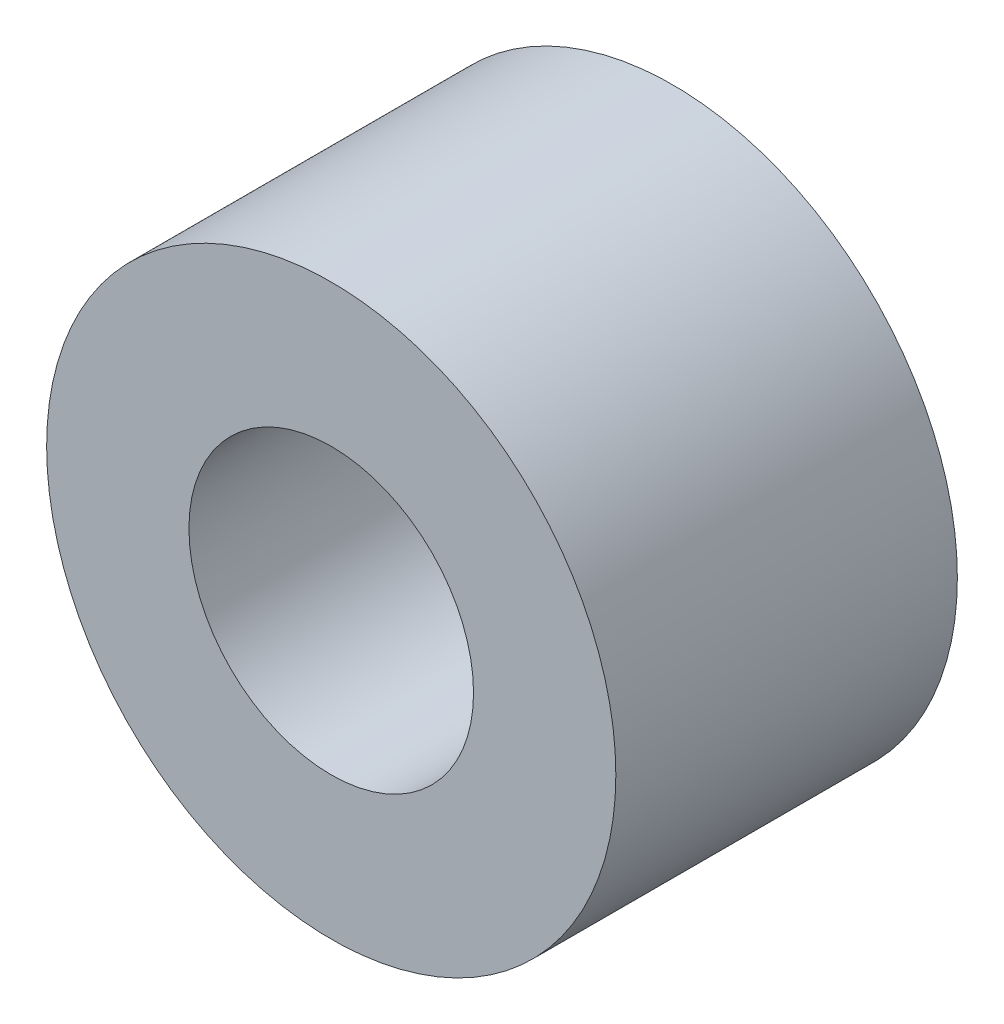
ISO-10303-21;
HEADER;
FILE_DESCRIPTION(('STEP AP214'),'2;1');
FILE_NAME('part.step','',(''),(''),'','','');
FILE_SCHEMA(('AUTOMOTIVE_DESIGN { 1 0 10303 214 1 1 1 1 }'));
ENDSEC;
DATA;
#1=APPLICATION_CONTEXT('core data for automotive mechanical design processes');
#2=APPLICATION_PROTOCOL_DEFINITION('international standard','automotive_design',2000,#1);
#3=PRODUCT_CONTEXT('',#1,'mechanical');
#4=PRODUCT('Part','Part','',(#3));
#5=PRODUCT_RELATED_PRODUCT_CATEGORY('part','',(#4));
#6=PRODUCT_DEFINITION_FORMATION('','',#4);
#7=PRODUCT_DEFINITION_CONTEXT('part definition',#1,'design');
#8=PRODUCT_DEFINITION('design','',#6,#7);
#9=PRODUCT_DEFINITION_SHAPE('','',#8);
#10=(LENGTH_UNIT() NAMED_UNIT(*) SI_UNIT(.MILLI.,.METRE.));
#11=(NAMED_UNIT(*) PLANE_ANGLE_UNIT() SI_UNIT($,.RADIAN.));
#12=(NAMED_UNIT(*) SI_UNIT($,.STERADIAN.) SOLID_ANGLE_UNIT());
#13=UNCERTAINTY_MEASURE_WITH_UNIT(LENGTH_MEASURE(1.E-05),#10,'distance_accuracy_value','');
#14=(GEOMETRIC_REPRESENTATION_CONTEXT(3) GLOBAL_UNCERTAINTY_ASSIGNED_CONTEXT((#13)) GLOBAL_UNIT_ASSIGNED_CONTEXT((#10,
#11,#12)) REPRESENTATION_CONTEXT('',''));
#15=CARTESIAN_POINT('',(0.,0.,0.));
#16=DIRECTION('',(0.,0.,1.));
#17=DIRECTION('',(1.,0.,0.));
#18=AXIS2_PLACEMENT_3D('',#15,#16,#17);
#19=CARTESIAN_POINT('',(45.5,14.8,6.));
#20=DIRECTION('',(0.,0.,1.));
#21=DIRECTION('',(1.,0.,0.));
#22=AXIS2_PLACEMENT_3D('',#19,#20,#21);
#23=PLANE('',#22);
#24=CARTESIAN_POINT('',(45.5,14.8,6.));
#25=DIRECTION('',(0.,0.,1.));
#26=DIRECTION('',(1.,0.,0.));
#27=AXIS2_PLACEMENT_3D('',#24,#25,#26);
#28=CIRCLE('',#27,5.);
#29=CARTESIAN_POINT('',(50.5,14.8,6.));
#30=VERTEX_POINT('',#29);
#31=EDGE_CURVE('E10',#30,#30,#28,.T.);
#32=ORIENTED_EDGE('',*,*,#31,.T.);
#33=EDGE_LOOP('',(#32));
#34=FACE_BOUND('',#33,.T.);
#35=CARTESIAN_POINT('',(45.5,14.8,6.));
#36=DIRECTION('',(0.,0.,1.));
#37=DIRECTION('',(1.,0.,0.));
#38=AXIS2_PLACEMENT_3D('',#35,#36,#37);
#39=CIRCLE('',#38,2.5);
#40=CARTESIAN_POINT('',(48.,14.8,6.));
#41=VERTEX_POINT('',#40);
#42=EDGE_CURVE('E46',#41,#41,#39,.T.);
#43=ORIENTED_EDGE('',*,*,#42,.F.);
#44=EDGE_LOOP('',(#43));
#45=FACE_BOUND('',#44,.T.);
#46=ADVANCED_FACE('F35',(#34,#45),#23,.T.);
#47=CARTESIAN_POINT('',(45.5,14.8,0.));
#48=DIRECTION('',(0.,0.,1.));
#49=DIRECTION('',(1.,0.,0.));
#50=AXIS2_PLACEMENT_3D('',#47,#48,#49);
#51=PLANE('',#50);
#52=CARTESIAN_POINT('',(45.5,14.8,0.));
#53=DIRECTION('',(0.,0.,1.));
#54=DIRECTION('',(1.,0.,0.));
#55=AXIS2_PLACEMENT_3D('',#52,#53,#54);
#56=CIRCLE('',#55,5.);
#57=CARTESIAN_POINT('',(50.5,14.8,0.));
#58=VERTEX_POINT('',#57);
#59=EDGE_CURVE('E39',#58,#58,#56,.T.);
#60=ORIENTED_EDGE('',*,*,#59,.F.);
#61=EDGE_LOOP('',(#60));
#62=FACE_BOUND('',#61,.T.);
#63=CARTESIAN_POINT('',(45.5,14.8,0.));
#64=DIRECTION('',(0.,0.,1.));
#65=DIRECTION('',(1.,0.,0.));
#66=AXIS2_PLACEMENT_3D('',#63,#64,#65);
#67=CIRCLE('',#66,2.5);
#68=CARTESIAN_POINT('',(48.,14.8,0.));
#69=VERTEX_POINT('',#68);
#70=EDGE_CURVE('E48',#69,#69,#67,.T.);
#71=ORIENTED_EDGE('',*,*,#70,.T.);
#72=EDGE_LOOP('',(#71));
#73=FACE_BOUND('',#72,.T.);
#74=ADVANCED_FACE('F58',(#62,#73),#51,.F.);
#75=CARTESIAN_POINT('',(45.5,14.8,6.));
#76=DIRECTION('',(0.,0.,-1.));
#77=DIRECTION('',(-1.,0.,0.));
#78=AXIS2_PLACEMENT_3D('',#75,#76,#77);
#79=CYLINDRICAL_SURFACE('',#78,5.);
#80=ORIENTED_EDGE('',*,*,#31,.F.);
#81=EDGE_LOOP('',(#80));
#82=FACE_BOUND('',#81,.T.);
#83=ORIENTED_EDGE('',*,*,#59,.T.);
#84=EDGE_LOOP('',(#83));
#85=FACE_BOUND('',#84,.T.);
#86=ADVANCED_FACE('F37',(#82,#85),#79,.T.);
#87=CARTESIAN_POINT('',(45.5,14.8,6.));
#88=DIRECTION('',(0.,0.,-1.));
#89=DIRECTION('',(-1.,0.,0.));
#90=AXIS2_PLACEMENT_3D('',#87,#88,#89);
#91=CYLINDRICAL_SURFACE('',#90,2.5);
#92=ORIENTED_EDGE('',*,*,#42,.T.);
#93=EDGE_LOOP('',(#92));
#94=FACE_BOUND('',#93,.T.);
#95=ORIENTED_EDGE('',*,*,#70,.F.);
#96=EDGE_LOOP('',(#95));
#97=FACE_BOUND('',#96,.T.);
#98=ADVANCED_FACE('F54',(#94,#97),#91,.F.);
#99=CLOSED_SHELL('',(#46,#74,#86,#98));
#100=MANIFOLD_SOLID_BREP('B2',#99);
#101=ADVANCED_BREP_SHAPE_REPRESENTATION('',(#18,#100),#14);
#102=SHAPE_DEFINITION_REPRESENTATION(#9,#101);
ENDSEC;
END-ISO-10303-21;
